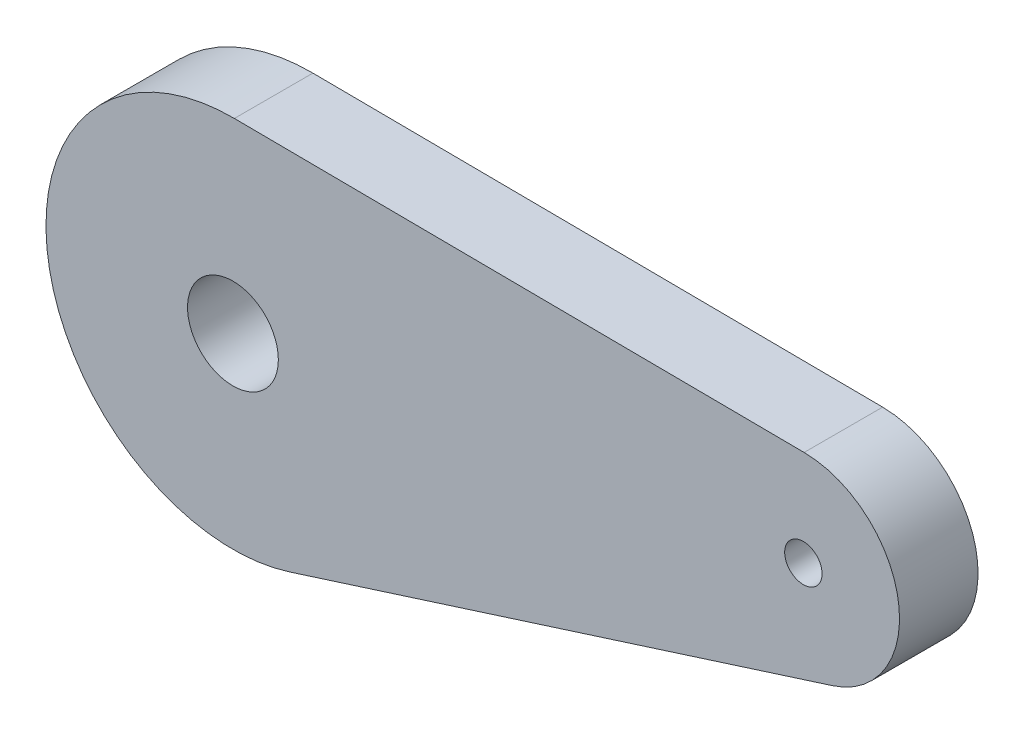
ISO-10303-21;
HEADER;
FILE_DESCRIPTION(('STEP AP214'),'2;1');
FILE_NAME('part.step','',(''),(''),'','','');
FILE_SCHEMA(('AUTOMOTIVE_DESIGN { 1 0 10303 214 1 1 1 1 }'));
ENDSEC;
DATA;
#1=APPLICATION_CONTEXT('core data for automotive mechanical design processes');
#2=APPLICATION_PROTOCOL_DEFINITION('international standard','automotive_design',2000,#1);
#3=PRODUCT_CONTEXT('',#1,'mechanical');
#4=PRODUCT('Part','Part','',(#3));
#5=PRODUCT_RELATED_PRODUCT_CATEGORY('part','',(#4));
#6=PRODUCT_DEFINITION_FORMATION('','',#4);
#7=PRODUCT_DEFINITION_CONTEXT('part definition',#1,'design');
#8=PRODUCT_DEFINITION('design','',#6,#7);
#9=PRODUCT_DEFINITION_SHAPE('','',#8);
#10=(LENGTH_UNIT() NAMED_UNIT(*) SI_UNIT(.MILLI.,.METRE.));
#11=(NAMED_UNIT(*) PLANE_ANGLE_UNIT() SI_UNIT($,.RADIAN.));
#12=(NAMED_UNIT(*) SI_UNIT($,.STERADIAN.) SOLID_ANGLE_UNIT());
#13=UNCERTAINTY_MEASURE_WITH_UNIT(LENGTH_MEASURE(1.E-05),#10,'distance_accuracy_value','');
#14=(GEOMETRIC_REPRESENTATION_CONTEXT(3) GLOBAL_UNCERTAINTY_ASSIGNED_CONTEXT((#13)) GLOBAL_UNIT_ASSIGNED_CONTEXT((#10,
#11,#12)) REPRESENTATION_CONTEXT('',''));
#15=CARTESIAN_POINT('',(0.,0.,0.));
#16=DIRECTION('',(0.,0.,1.));
#17=DIRECTION('',(1.,0.,0.));
#18=AXIS2_PLACEMENT_3D('',#15,#16,#17);
#19=CARTESIAN_POINT('',(-13.2916477118002,41.7206373718306,3.675));
#20=DIRECTION('',(0.303554104628691,-0.952814203065358,0.));
#21=DIRECTION('',(0.952814203065358,0.303554104628691,0.));
#22=AXIS2_PLACEMENT_3D('',#19,#20,#21);
#23=PLANE('',#22);
#24=DIRECTION('',(-0.952814203065358,-0.303554104628691,0.));
#25=VECTOR('',#24,1.);
#26=CARTESIAN_POINT('',(-13.2916477118002,41.7206373718306,-3.675));
#27=LINE('',#26,#25);
#28=CARTESIAN_POINT('',(35.9027507316927,57.3933273088815,-3.675));
#29=VERTEX_POINT('',#28);
#30=CARTESIAN_POINT('',(-14.9078031689979,41.2057514463562,-3.675));
#31=VERTEX_POINT('',#30);
#32=EDGE_CURVE('E104',#29,#31,#27,.T.);
#33=ORIENTED_EDGE('',*,*,#32,.F.);
#34=DIRECTION('',(0.,0.,-1.));
#35=VECTOR('',#34,1.);
#36=CARTESIAN_POINT('',(35.9027507316927,57.3933273088815,3.675));
#37=LINE('',#36,#35);
#38=CARTESIAN_POINT('',(35.9027507316927,57.3933273088815,3.675));
#39=VERTEX_POINT('',#38);
#40=EDGE_CURVE('E11',#39,#29,#37,.T.);
#41=ORIENTED_EDGE('',*,*,#40,.F.);
#42=DIRECTION('',(-0.952814203065358,-0.303554104628691,0.));
#43=VECTOR('',#42,1.);
#44=CARTESIAN_POINT('',(-13.2916477118002,41.7206373718306,3.675));
#45=LINE('',#44,#43);
#46=CARTESIAN_POINT('',(-14.9078031689979,41.2057514463562,3.675));
#47=VERTEX_POINT('',#46);
#48=EDGE_CURVE('E83',#39,#47,#45,.T.);
#49=ORIENTED_EDGE('',*,*,#48,.T.);
#50=DIRECTION('',(0.,0.,-1.));
#51=VECTOR('',#50,1.);
#52=CARTESIAN_POINT('',(-14.9078031689979,41.2057514463562,3.675));
#53=LINE('',#52,#51);
#54=EDGE_CURVE('E72',#47,#31,#53,.T.);
#55=ORIENTED_EDGE('',*,*,#54,.T.);
#56=EDGE_LOOP('',(#33,#41,#49,#55));
#57=FACE_BOUND('',#56,.T.);
#58=ADVANCED_FACE('F34',(#57),#23,.T.);
#59=CARTESIAN_POINT('',(33.1707637900345,65.9686551364697,3.675));
#60=DIRECTION('',(0.,0.,-1.));
#61=DIRECTION('',(-1.,0.,0.));
#62=AXIS2_PLACEMENT_3D('',#59,#60,#61);
#63=CYLINDRICAL_SURFACE('',#62,9.00000000000001);
#64=CARTESIAN_POINT('',(33.1707637900345,65.9686551364697,-3.675));
#65=DIRECTION('',(0.,0.,1.));
#66=DIRECTION('',(1.,0.,0.));
#67=AXIS2_PLACEMENT_3D('',#64,#65,#66);
#68=CIRCLE('',#67,9.00000000000001);
#69=CARTESIAN_POINT('',(33.2401440842732,74.9683877088727,-3.675));
#70=VERTEX_POINT('',#69);
#71=EDGE_CURVE('E89',#29,#70,#68,.T.);
#72=ORIENTED_EDGE('',*,*,#71,.T.);
#73=DIRECTION('',(0.,0.,-1.));
#74=VECTOR('',#73,1.);
#75=CARTESIAN_POINT('',(33.2401440842732,74.9683877088727,3.675));
#76=LINE('',#75,#74);
#77=CARTESIAN_POINT('',(33.2401440842732,74.9683877088727,3.675));
#78=VERTEX_POINT('',#77);
#79=EDGE_CURVE('E42',#78,#70,#76,.T.);
#80=ORIENTED_EDGE('',*,*,#79,.F.);
#81=CARTESIAN_POINT('',(33.1707637900345,65.9686551364697,3.675));
#82=DIRECTION('',(0.,0.,1.));
#83=DIRECTION('',(1.,0.,0.));
#84=AXIS2_PLACEMENT_3D('',#81,#82,#83);
#85=CIRCLE('',#84,9.00000000000001);
#86=EDGE_CURVE('E77',#39,#78,#85,.T.);
#87=ORIENTED_EDGE('',*,*,#86,.F.);
#88=ORIENTED_EDGE('',*,*,#40,.T.);
#89=EDGE_LOOP('',(#72,#80,#87,#88));
#90=FACE_BOUND('',#89,.T.);
#91=ADVANCED_FACE('F87',(#90),#63,.T.);
#92=CARTESIAN_POINT('',(0.579883627133994,75.2201705771077,3.675));
#93=DIRECTION('',(0.00770892158207196,0.999970285822555,0.));
#94=DIRECTION('',(-0.999970285822555,0.00770892158207196,0.));
#95=AXIS2_PLACEMENT_3D('',#92,#93,#94);
#96=PLANE('',#95);
#97=DIRECTION('',(0.999970285822555,-0.00770892158207197,0.));
#98=VECTOR('',#97,1.);
#99=CARTESIAN_POINT('',(0.579883627133994,75.2201705771077,-3.675));
#100=LINE('',#99,#98);
#101=CARTESIAN_POINT('',(-20.0850938723138,75.3794800018947,-3.675));
#102=VERTEX_POINT('',#101);
#103=EDGE_CURVE('E108',#102,#70,#100,.T.);
#104=ORIENTED_EDGE('',*,*,#103,.F.);
#105=DIRECTION('',(0.,0.,-1.));
#106=VECTOR('',#105,1.);
#107=CARTESIAN_POINT('',(-20.0850938723138,75.3794800018947,3.675));
#108=LINE('',#107,#106);
#109=CARTESIAN_POINT('',(-20.0850938723138,75.3794800018947,3.675));
#110=VERTEX_POINT('',#109);
#111=EDGE_CURVE('E65',#110,#102,#108,.T.);
#112=ORIENTED_EDGE('',*,*,#111,.F.);
#113=DIRECTION('',(0.999970285822555,-0.00770892158207197,0.));
#114=VECTOR('',#113,1.);
#115=CARTESIAN_POINT('',(0.579883627133994,75.2201705771077,3.675));
#116=LINE('',#115,#114);
#117=EDGE_CURVE('E82',#110,#78,#116,.T.);
#118=ORIENTED_EDGE('',*,*,#117,.T.);
#119=ORIENTED_EDGE('',*,*,#79,.T.);
#120=EDGE_LOOP('',(#104,#112,#118,#119));
#121=FACE_BOUND('',#120,.T.);
#122=ADVANCED_FACE('F93',(#121),#96,.T.);
#123=CARTESIAN_POINT('',(33.1707637900345,65.9686551364697,3.675));
#124=DIRECTION('',(0.,0.,-1.));
#125=DIRECTION('',(-1.,0.,0.));
#126=AXIS2_PLACEMENT_3D('',#123,#124,#125);
#127=CYLINDRICAL_SURFACE('',#126,1.75);
#128=CARTESIAN_POINT('',(33.1707637900345,65.9686551364697,3.675));
#129=DIRECTION('',(0.,0.,1.));
#130=DIRECTION('',(1.,0.,0.));
#131=AXIS2_PLACEMENT_3D('',#128,#129,#130);
#132=CIRCLE('',#131,1.75);
#133=CARTESIAN_POINT('',(34.9207637900345,65.9686551364697,3.675));
#134=VERTEX_POINT('',#133);
#135=EDGE_CURVE('E95',#134,#134,#132,.T.);
#136=ORIENTED_EDGE('',*,*,#135,.T.);
#137=EDGE_LOOP('',(#136));
#138=FACE_BOUND('',#137,.T.);
#139=CARTESIAN_POINT('',(33.1707637900345,65.9686551364697,-3.675));
#140=DIRECTION('',(0.,0.,1.));
#141=DIRECTION('',(1.,0.,0.));
#142=AXIS2_PLACEMENT_3D('',#139,#140,#141);
#143=CIRCLE('',#142,1.75);
#144=CARTESIAN_POINT('',(34.9207637900345,65.9686551364697,-3.675));
#145=VERTEX_POINT('',#144);
#146=EDGE_CURVE('E112',#145,#145,#143,.T.);
#147=ORIENTED_EDGE('',*,*,#146,.F.);
#148=EDGE_LOOP('',(#147));
#149=FACE_BOUND('',#148,.T.);
#150=ADVANCED_FACE('F128',(#138,#149),#127,.F.);
#151=CARTESIAN_POINT('',(-20.22,57.88,3.675));
#152=DIRECTION('',(0.,0.,-1.));
#153=DIRECTION('',(-1.,0.,0.));
#154=AXIS2_PLACEMENT_3D('',#151,#152,#153);
#155=CYLINDRICAL_SURFACE('',#154,17.5);
#156=CARTESIAN_POINT('',(-20.22,57.88,-3.675));
#157=DIRECTION('',(0.,0.,1.));
#158=DIRECTION('',(1.,0.,0.));
#159=AXIS2_PLACEMENT_3D('',#156,#157,#158);
#160=CIRCLE('',#159,17.5);
#161=EDGE_CURVE('E110',#102,#31,#160,.T.);
#162=ORIENTED_EDGE('',*,*,#161,.T.);
#163=ORIENTED_EDGE('',*,*,#54,.F.);
#164=CARTESIAN_POINT('',(-20.22,57.88,3.675));
#165=DIRECTION('',(0.,0.,1.));
#166=DIRECTION('',(1.,0.,0.));
#167=AXIS2_PLACEMENT_3D('',#164,#165,#166);
#168=CIRCLE('',#167,17.5);
#169=EDGE_CURVE('E50',#110,#47,#168,.T.);
#170=ORIENTED_EDGE('',*,*,#169,.F.);
#171=ORIENTED_EDGE('',*,*,#111,.T.);
#172=EDGE_LOOP('',(#162,#163,#170,#171));
#173=FACE_BOUND('',#172,.T.);
#174=ADVANCED_FACE('F131',(#173),#155,.T.);
#175=CARTESIAN_POINT('',(-20.22,57.88,3.675));
#176=DIRECTION('',(0.,0.,-1.));
#177=DIRECTION('',(-1.,0.,0.));
#178=AXIS2_PLACEMENT_3D('',#175,#176,#177);
#179=CYLINDRICAL_SURFACE('',#178,4.25);
#180=CARTESIAN_POINT('',(-20.22,57.88,3.675));
#181=DIRECTION('',(0.,0.,1.));
#182=DIRECTION('',(1.,0.,0.));
#183=AXIS2_PLACEMENT_3D('',#180,#181,#182);
#184=CIRCLE('',#183,4.25);
#185=CARTESIAN_POINT('',(-15.97,57.88,3.675));
#186=VERTEX_POINT('',#185);
#187=EDGE_CURVE('E101',#186,#186,#184,.T.);
#188=ORIENTED_EDGE('',*,*,#187,.T.);
#189=EDGE_LOOP('',(#188));
#190=FACE_BOUND('',#189,.T.);
#191=CARTESIAN_POINT('',(-20.22,57.88,-3.675));
#192=DIRECTION('',(0.,0.,1.));
#193=DIRECTION('',(1.,0.,0.));
#194=AXIS2_PLACEMENT_3D('',#191,#192,#193);
#195=CIRCLE('',#194,4.25);
#196=CARTESIAN_POINT('',(-15.97,57.88,-3.675));
#197=VERTEX_POINT('',#196);
#198=EDGE_CURVE('E115',#197,#197,#195,.T.);
#199=ORIENTED_EDGE('',*,*,#198,.F.);
#200=EDGE_LOOP('',(#199));
#201=FACE_BOUND('',#200,.T.);
#202=ADVANCED_FACE('F134',(#190,#201),#179,.F.);
#203=CARTESIAN_POINT('',(0.,0.,3.675));
#204=DIRECTION('',(0.,0.,1.));
#205=DIRECTION('',(1.,0.,0.));
#206=AXIS2_PLACEMENT_3D('',#203,#204,#205);
#207=PLANE('',#206);
#208=ORIENTED_EDGE('',*,*,#48,.F.);
#209=ORIENTED_EDGE('',*,*,#86,.T.);
#210=ORIENTED_EDGE('',*,*,#117,.F.);
#211=ORIENTED_EDGE('',*,*,#169,.T.);
#212=EDGE_LOOP('',(#208,#209,#210,#211));
#213=FACE_BOUND('',#212,.T.);
#214=ORIENTED_EDGE('',*,*,#135,.F.);
#215=EDGE_LOOP('',(#214));
#216=FACE_BOUND('',#215,.T.);
#217=ORIENTED_EDGE('',*,*,#187,.F.);
#218=EDGE_LOOP('',(#217));
#219=FACE_BOUND('',#218,.T.);
#220=ADVANCED_FACE('F79',(#213,#216,#219),#207,.T.);
#221=CARTESIAN_POINT('',(0.,0.,-3.675));
#222=DIRECTION('',(0.,0.,1.));
#223=DIRECTION('',(1.,0.,0.));
#224=AXIS2_PLACEMENT_3D('',#221,#222,#223);
#225=PLANE('',#224);
#226=ORIENTED_EDGE('',*,*,#32,.T.);
#227=ORIENTED_EDGE('',*,*,#161,.F.);
#228=ORIENTED_EDGE('',*,*,#103,.T.);
#229=ORIENTED_EDGE('',*,*,#71,.F.);
#230=EDGE_LOOP('',(#226,#227,#228,#229));
#231=FACE_BOUND('',#230,.T.);
#232=ORIENTED_EDGE('',*,*,#146,.T.);
#233=EDGE_LOOP('',(#232));
#234=FACE_BOUND('',#233,.T.);
#235=ORIENTED_EDGE('',*,*,#198,.T.);
#236=EDGE_LOOP('',(#235));
#237=FACE_BOUND('',#236,.T.);
#238=ADVANCED_FACE('F141',(#231,#234,#237),#225,.F.);
#239=CLOSED_SHELL('',(#58,#91,#122,#150,#174,#202,#220,#238));
#240=MANIFOLD_SOLID_BREP('B2',#239);
#241=ADVANCED_BREP_SHAPE_REPRESENTATION('',(#18,#240),#14);
#242=SHAPE_DEFINITION_REPRESENTATION(#9,#241);
ENDSEC;
END-ISO-10303-21;
